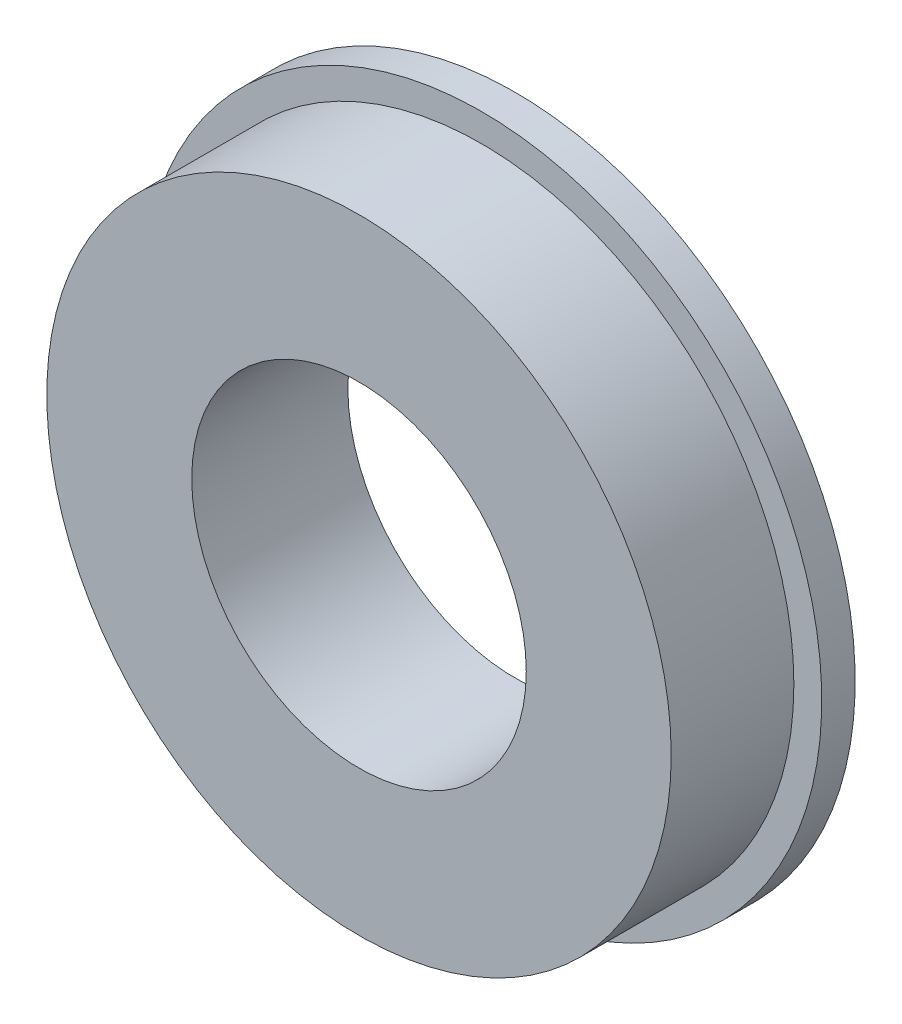
ISO-10303-21;
HEADER;
FILE_DESCRIPTION(('STEP AP214'),'2;1');
FILE_NAME('part.step','',(''),(''),'','','');
FILE_SCHEMA(('AUTOMOTIVE_DESIGN { 1 0 10303 214 1 1 1 1 }'));
ENDSEC;
DATA;
#1=APPLICATION_CONTEXT('core data for automotive mechanical design processes');
#2=APPLICATION_PROTOCOL_DEFINITION('international standard','automotive_design',2000,#1);
#3=PRODUCT_CONTEXT('',#1,'mechanical');
#4=PRODUCT('Part','Part','',(#3));
#5=PRODUCT_RELATED_PRODUCT_CATEGORY('part','',(#4));
#6=PRODUCT_DEFINITION_FORMATION('','',#4);
#7=PRODUCT_DEFINITION_CONTEXT('part definition',#1,'design');
#8=PRODUCT_DEFINITION('design','',#6,#7);
#9=PRODUCT_DEFINITION_SHAPE('','',#8);
#10=(LENGTH_UNIT() NAMED_UNIT(*) SI_UNIT(.MILLI.,.METRE.));
#11=(NAMED_UNIT(*) PLANE_ANGLE_UNIT() SI_UNIT($,.RADIAN.));
#12=(NAMED_UNIT(*) SI_UNIT($,.STERADIAN.) SOLID_ANGLE_UNIT());
#13=UNCERTAINTY_MEASURE_WITH_UNIT(LENGTH_MEASURE(1.E-05),#10,'distance_accuracy_value','');
#14=(GEOMETRIC_REPRESENTATION_CONTEXT(3) GLOBAL_UNCERTAINTY_ASSIGNED_CONTEXT((#13)) GLOBAL_UNIT_ASSIGNED_CONTEXT((#10,
#11,#12)) REPRESENTATION_CONTEXT('',''));
#15=CARTESIAN_POINT('',(0.,0.,0.));
#16=DIRECTION('',(0.,0.,1.));
#17=DIRECTION('',(1.,0.,0.));
#18=AXIS2_PLACEMENT_3D('',#15,#16,#17);
#19=CARTESIAN_POINT('',(0.,0.,5.5));
#20=DIRECTION('',(0.,0.,1.));
#21=DIRECTION('',(1.,0.,0.));
#22=AXIS2_PLACEMENT_3D('',#19,#20,#21);
#23=PLANE('',#22);
#24=CARTESIAN_POINT('',(0.,0.,5.5));
#25=DIRECTION('',(0.,0.,1.));
#26=DIRECTION('',(1.,0.,0.));
#27=AXIS2_PLACEMENT_3D('',#24,#25,#26);
#28=CIRCLE('',#27,14.);
#29=CARTESIAN_POINT('',(14.,0.,5.5));
#30=VERTEX_POINT('',#29);
#31=EDGE_CURVE('E10',#30,#30,#28,.T.);
#32=ORIENTED_EDGE('',*,*,#31,.T.);
#33=EDGE_LOOP('',(#32));
#34=FACE_BOUND('',#33,.T.);
#35=CARTESIAN_POINT('',(0.,0.,5.5));
#36=DIRECTION('',(0.,0.,1.));
#37=DIRECTION('',(1.,0.,0.));
#38=AXIS2_PLACEMENT_3D('',#35,#36,#37);
#39=CIRCLE('',#38,7.5);
#40=CARTESIAN_POINT('',(7.5,0.,5.5));
#41=VERTEX_POINT('',#40);
#42=EDGE_CURVE('E41',#41,#41,#39,.T.);
#43=ORIENTED_EDGE('',*,*,#42,.F.);
#44=EDGE_LOOP('',(#43));
#45=FACE_BOUND('',#44,.T.);
#46=ADVANCED_FACE('F33',(#34,#45),#23,.T.);
#47=CARTESIAN_POINT('',(0.,0.,5.5));
#48=DIRECTION('',(0.,0.,-1.));
#49=DIRECTION('',(-1.,0.,0.));
#50=AXIS2_PLACEMENT_3D('',#47,#48,#49);
#51=CYLINDRICAL_SURFACE('',#50,14.);
#52=ORIENTED_EDGE('',*,*,#31,.F.);
#53=EDGE_LOOP('',(#52));
#54=FACE_BOUND('',#53,.T.);
#55=CARTESIAN_POINT('',(0.,0.,0.));
#56=DIRECTION('',(0.,0.,1.));
#57=DIRECTION('',(1.,0.,0.));
#58=AXIS2_PLACEMENT_3D('',#55,#56,#57);
#59=CIRCLE('',#58,14.);
#60=CARTESIAN_POINT('',(14.,0.,0.));
#61=VERTEX_POINT('',#60);
#62=EDGE_CURVE('E37',#61,#61,#59,.T.);
#63=ORIENTED_EDGE('',*,*,#62,.T.);
#64=EDGE_LOOP('',(#63));
#65=FACE_BOUND('',#64,.T.);
#66=ADVANCED_FACE('F35',(#54,#65),#51,.T.);
#67=CARTESIAN_POINT('',(0.,0.,5.5));
#68=DIRECTION('',(0.,0.,-1.));
#69=DIRECTION('',(-1.,0.,0.));
#70=AXIS2_PLACEMENT_3D('',#67,#68,#69);
#71=CYLINDRICAL_SURFACE('',#70,7.5);
#72=ORIENTED_EDGE('',*,*,#42,.T.);
#73=EDGE_LOOP('',(#72));
#74=FACE_BOUND('',#73,.T.);
#75=CARTESIAN_POINT('',(0.,0.,-1.5));
#76=DIRECTION('',(0.,0.,-1.));
#77=DIRECTION('',(-1.,0.,0.));
#78=AXIS2_PLACEMENT_3D('',#75,#76,#77);
#79=CIRCLE('',#78,7.5);
#80=CARTESIAN_POINT('',(-7.5,0.,-1.5));
#81=VERTEX_POINT('',#80);
#82=EDGE_CURVE('E51',#81,#81,#79,.T.);
#83=ORIENTED_EDGE('',*,*,#82,.T.);
#84=EDGE_LOOP('',(#83));
#85=FACE_BOUND('',#84,.T.);
#86=ADVANCED_FACE('F57',(#74,#85),#71,.F.);
#87=CARTESIAN_POINT('',(0.,0.,-1.5));
#88=DIRECTION('',(0.,0.,-1.));
#89=DIRECTION('',(-1.,0.,0.));
#90=AXIS2_PLACEMENT_3D('',#87,#88,#89);
#91=PLANE('',#90);
#92=CARTESIAN_POINT('',(0.,0.,-1.5));
#93=DIRECTION('',(0.,0.,-1.));
#94=DIRECTION('',(-1.,0.,0.));
#95=AXIS2_PLACEMENT_3D('',#92,#93,#94);
#96=CIRCLE('',#95,15.25);
#97=CARTESIAN_POINT('',(-15.25,0.,-1.5));
#98=VERTEX_POINT('',#97);
#99=EDGE_CURVE('E50',#98,#98,#96,.T.);
#100=ORIENTED_EDGE('',*,*,#99,.T.);
#101=EDGE_LOOP('',(#100));
#102=FACE_BOUND('',#101,.T.);
#103=ORIENTED_EDGE('',*,*,#82,.F.);
#104=EDGE_LOOP('',(#103));
#105=FACE_BOUND('',#104,.T.);
#106=ADVANCED_FACE('F59',(#102,#105),#91,.T.);
#107=CARTESIAN_POINT('',(0.,0.,0.));
#108=DIRECTION('',(0.,0.,-1.));
#109=DIRECTION('',(-1.,0.,0.));
#110=AXIS2_PLACEMENT_3D('',#107,#108,#109);
#111=PLANE('',#110);
#112=ORIENTED_EDGE('',*,*,#62,.F.);
#113=EDGE_LOOP('',(#112));
#114=FACE_BOUND('',#113,.T.);
#115=CARTESIAN_POINT('',(0.,0.,0.));
#116=DIRECTION('',(0.,0.,-1.));
#117=DIRECTION('',(-1.,0.,0.));
#118=AXIS2_PLACEMENT_3D('',#115,#116,#117);
#119=CIRCLE('',#118,15.25);
#120=CARTESIAN_POINT('',(-15.25,0.,0.));
#121=VERTEX_POINT('',#120);
#122=EDGE_CURVE('E47',#121,#121,#119,.T.);
#123=ORIENTED_EDGE('',*,*,#122,.F.);
#124=EDGE_LOOP('',(#123));
#125=FACE_BOUND('',#124,.T.);
#126=ADVANCED_FACE('F61',(#114,#125),#111,.F.);
#127=CARTESIAN_POINT('',(0.,0.,-1.5));
#128=DIRECTION('',(0.,0.,1.));
#129=DIRECTION('',(1.,0.,0.));
#130=AXIS2_PLACEMENT_3D('',#127,#128,#129);
#131=CYLINDRICAL_SURFACE('',#130,15.25);
#132=ORIENTED_EDGE('',*,*,#99,.F.);
#133=EDGE_LOOP('',(#132));
#134=FACE_BOUND('',#133,.T.);
#135=ORIENTED_EDGE('',*,*,#122,.T.);
#136=EDGE_LOOP('',(#135));
#137=FACE_BOUND('',#136,.T.);
#138=ADVANCED_FACE('F68',(#134,#137),#131,.T.);
#139=CLOSED_SHELL('',(#46,#66,#86,#106,#126,#138));
#140=MANIFOLD_SOLID_BREP('B2',#139);
#141=ADVANCED_BREP_SHAPE_REPRESENTATION('',(#18,#140),#14);
#142=SHAPE_DEFINITION_REPRESENTATION(#9,#141);
ENDSEC;
END-ISO-10303-21;
